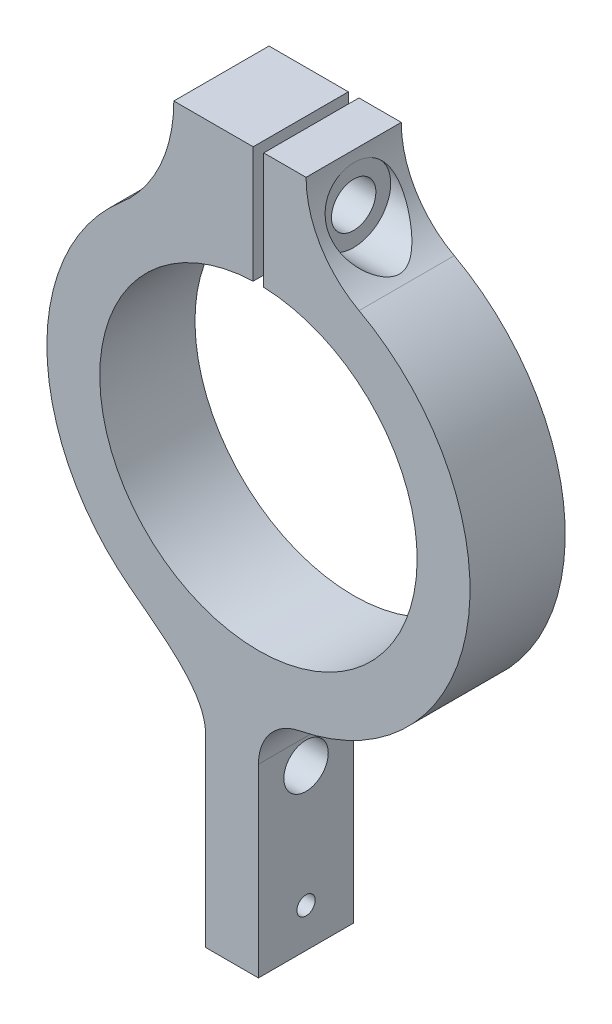
ISO-10303-21;
HEADER;
FILE_DESCRIPTION(('STEP AP214'),'2;1');
FILE_NAME('part.step','',(''),(''),'','','');
FILE_SCHEMA(('AUTOMOTIVE_DESIGN { 1 0 10303 214 1 1 1 1 }'));
ENDSEC;
DATA;
#1=APPLICATION_CONTEXT('core data for automotive mechanical design processes');
#2=APPLICATION_PROTOCOL_DEFINITION('international standard','automotive_design',2000,#1);
#3=PRODUCT_CONTEXT('',#1,'mechanical');
#4=PRODUCT('Part','Part','',(#3));
#5=PRODUCT_RELATED_PRODUCT_CATEGORY('part','',(#4));
#6=PRODUCT_DEFINITION_FORMATION('','',#4);
#7=PRODUCT_DEFINITION_CONTEXT('part definition',#1,'design');
#8=PRODUCT_DEFINITION('design','',#6,#7);
#9=PRODUCT_DEFINITION_SHAPE('','',#8);
#10=(LENGTH_UNIT() NAMED_UNIT(*) SI_UNIT(.MILLI.,.METRE.));
#11=(NAMED_UNIT(*) PLANE_ANGLE_UNIT() SI_UNIT($,.RADIAN.));
#12=(NAMED_UNIT(*) SI_UNIT($,.STERADIAN.) SOLID_ANGLE_UNIT());
#13=UNCERTAINTY_MEASURE_WITH_UNIT(LENGTH_MEASURE(1.E-05),#10,'distance_accuracy_value','');
#14=(GEOMETRIC_REPRESENTATION_CONTEXT(3) GLOBAL_UNCERTAINTY_ASSIGNED_CONTEXT((#13)) GLOBAL_UNIT_ASSIGNED_CONTEXT((#10,
#11,#12)) REPRESENTATION_CONTEXT('',''));
#15=CARTESIAN_POINT('',(0.,0.,0.));
#16=DIRECTION('',(0.,0.,1.));
#17=DIRECTION('',(1.,0.,0.));
#18=AXIS2_PLACEMENT_3D('',#15,#16,#17);
#19=CARTESIAN_POINT('',(28.1129032258065,52.,18.));
#20=DIRECTION('',(0.,0.,-1.));
#21=DIRECTION('',(-1.,0.,0.));
#22=AXIS2_PLACEMENT_3D('',#19,#20,#21);
#23=CYLINDRICAL_SURFACE('',#22,19.1129032258065);
#24=CARTESIAN_POINT('',(28.1129032258065,52.,0.));
#25=DIRECTION('',(0.,0.,-1.));
#26=DIRECTION('',(1.,0.,0.));
#27=AXIS2_PLACEMENT_3D('',#24,#25,#26);
#28=CIRCLE('',#27,19.1129032258065);
#29=CARTESIAN_POINT('',(19.0231923601637,35.1869031377899,0.));
#30=VERTEX_POINT('',#29);
#31=CARTESIAN_POINT('',(9.,52.,0.));
#32=VERTEX_POINT('',#31);
#33=EDGE_CURVE('E193',#30,#32,#28,.T.);
#34=ORIENTED_EDGE('',*,*,#33,.T.);
#35=DIRECTION('',(0.,0.,-1.));
#36=VECTOR('',#35,1.);
#37=CARTESIAN_POINT('',(9.,52.,18.));
#38=LINE('',#37,#36);
#39=CARTESIAN_POINT('',(9.,52.,18.));
#40=VERTEX_POINT('',#39);
#41=EDGE_CURVE('E219',#40,#32,#38,.T.);
#42=ORIENTED_EDGE('',*,*,#41,.F.);
#43=CARTESIAN_POINT('',(28.1129032258065,52.,18.));
#44=DIRECTION('',(0.,0.,-1.));
#45=DIRECTION('',(1.,0.,0.));
#46=AXIS2_PLACEMENT_3D('',#43,#44,#45);
#47=CIRCLE('',#46,19.1129032258065);
#48=CARTESIAN_POINT('',(19.0231923601637,35.1869031377899,18.));
#49=VERTEX_POINT('',#48);
#50=EDGE_CURVE('E327',#49,#40,#47,.T.);
#51=ORIENTED_EDGE('',*,*,#50,.F.);
#52=DIRECTION('',(0.,0.,-1.));
#53=VECTOR('',#52,1.);
#54=CARTESIAN_POINT('',(19.0231923601637,35.1869031377899,18.));
#55=LINE('',#54,#53);
#56=EDGE_CURVE('E222',#49,#30,#55,.T.);
#57=ORIENTED_EDGE('',*,*,#56,.T.);
#58=EDGE_LOOP('',(#34,#42,#51,#57));
#59=FACE_BOUND('',#58,.T.);
#60=CARTESIAN_POINT('',(17.6580923849044,36.,9.));
#61=CARTESIAN_POINT('',(17.6580901842161,36.0000010755365,8.88235732236984));
#62=CARTESIAN_POINT('',(17.6535371587383,36.002973632593,8.76467912745882));
#63=CARTESIAN_POINT('',(17.6354851467937,36.0147914781101,8.53026235110104));
#64=CARTESIAN_POINT('',(17.6219806304406,36.0236403967666,8.41352439564622));
#65=CARTESIAN_POINT('',(17.5864642358954,36.0470190077582,8.18167290114202));
#66=CARTESIAN_POINT('',(17.5644339522932,36.0615609910637,8.06656343880819));
#67=CARTESIAN_POINT('',(17.512568717232,36.0960085510067,7.83889149575266));
#68=CARTESIAN_POINT('',(17.4827293596723,36.1159171558351,7.72633049202438));
#69=CARTESIAN_POINT('',(17.4062616720574,36.1673250436832,7.47158695888006));
#70=CARTESIAN_POINT('',(17.3572771232616,36.2005110752184,7.3304506851968));
#71=CARTESIAN_POINT('',(17.2495002106957,36.2744217736509,7.05394997301961));
#72=CARTESIAN_POINT('',(17.1906998895253,36.3151525598523,6.91859033020005));
#73=CARTESIAN_POINT('',(17.0649892451219,36.4034436360839,6.65373386249375));
#74=CARTESIAN_POINT('',(16.9980653344239,36.4510153935157,6.52424737192376));
#75=CARTESIAN_POINT('',(16.8577664170625,36.5522668642214,6.2713959982453));
#76=CARTESIAN_POINT('',(16.7843930706783,36.6059450065683,6.14802955237135));
#77=CARTESIAN_POINT('',(16.5869619535518,36.752751243214,5.83500988027252));
#78=CARTESIAN_POINT('',(16.4588778191135,36.8502452943915,5.64993059203384));
#79=CARTESIAN_POINT('',(16.1936787939994,37.05799219418,5.2939175240548));
#80=CARTESIAN_POINT('',(16.0565584712705,37.1682527480078,5.12299239490636));
#81=CARTESIAN_POINT('',(15.7762000147324,37.4006159472294,4.79435722798566));
#82=CARTESIAN_POINT('',(15.6329549294902,37.5227322595644,4.63666284193071));
#83=CARTESIAN_POINT('',(15.3428275507618,37.7779895557299,4.33419288343536));
#84=CARTESIAN_POINT('',(15.195945952117,37.9111284446614,4.18941486698796));
#85=CARTESIAN_POINT('',(14.8915544317699,38.1961954860347,3.90426926188932));
#86=CARTESIAN_POINT('',(14.7339299173374,38.3487692858974,3.76466964529908));
#87=CARTESIAN_POINT('',(14.4183045731971,38.6654199953416,3.49963262572111));
#88=CARTESIAN_POINT('',(14.2603037147934,38.8294978111077,3.37419634043137));
#89=CARTESIAN_POINT('',(13.9455152442641,39.1687218688792,3.1379182261632));
#90=CARTESIAN_POINT('',(13.7887269728162,39.3438615397675,3.02706785111911));
#91=CARTESIAN_POINT('',(13.4776205933729,39.7049457043666,2.82052830141579));
#92=CARTESIAN_POINT('',(13.3233023759787,39.8908897178542,2.72483845361653));
#93=CARTESIAN_POINT('',(13.0196460542137,40.2715961632454,2.55024771855266));
#94=CARTESIAN_POINT('',(12.8702775970787,40.4662743018088,2.47121626422597));
#95=CARTESIAN_POINT('',(12.5764241674868,40.8652675781668,2.33009066481484));
#96=CARTESIAN_POINT('',(12.4319394005677,41.0695831207019,2.26799723181794));
#97=CARTESIAN_POINT('',(12.1491636081969,41.4868858519556,2.16210615525078));
#98=CARTESIAN_POINT('',(12.0108687137373,41.6998674603495,2.11829693634372));
#99=CARTESIAN_POINT('',(11.7415977901336,42.1334652014358,2.05037801304662));
#100=CARTESIAN_POINT('',(11.610620382729,42.3540798836641,2.02626458718918));
#101=CARTESIAN_POINT('',(11.3783240236921,42.7640475933536,2.00148797591833));
#102=CARTESIAN_POINT('',(11.2757042314319,42.9524707250311,1.99758187323488));
#103=CARTESIAN_POINT('',(11.0770039475465,43.3324088323346,2.00531686815198));
#104=CARTESIAN_POINT('',(10.9809222833666,43.5239232459043,2.01695517023872));
#105=CARTESIAN_POINT('',(10.7958985967472,43.9086487105881,2.05653278992353));
#106=CARTESIAN_POINT('',(10.7069542045307,44.1018591747295,2.08446667123787));
#107=CARTESIAN_POINT('',(10.5366556512286,44.4884620419484,2.15725451217697));
#108=CARTESIAN_POINT('',(10.4553015912212,44.6818544474141,2.20210869708437));
#109=CARTESIAN_POINT('',(10.3001239637233,45.068080318591,2.30945216492081));
#110=CARTESIAN_POINT('',(10.2263437525725,45.2609050259026,2.37203602054572));
#111=CARTESIAN_POINT('',(10.0870218333628,45.6429554686599,2.5149112360939));
#112=CARTESIAN_POINT('',(10.0214802357444,45.8321811558311,2.59520283335375));
#113=CARTESIAN_POINT('',(9.89865982124417,46.2049234372379,2.77335353838577));
#114=CARTESIAN_POINT('',(9.84137952945088,46.388441045951,2.87120950332814));
#115=CARTESIAN_POINT('',(9.7348848710466,46.7477039144138,3.08406405284738));
#116=CARTESIAN_POINT('',(9.6856698134005,46.923449839104,3.19906116714424));
#117=CARTESIAN_POINT('',(9.59921415895725,47.2489970685468,3.43381497979541));
#118=CARTESIAN_POINT('',(9.56128164189457,47.399681128527,3.55209656306455));
#119=CARTESIAN_POINT('',(9.49132078621771,47.6916050748106,3.80137746977728));
#120=CARTESIAN_POINT('',(9.4592922968812,47.8328452021469,3.93237646843104));
#121=CARTESIAN_POINT('',(9.40066346505474,48.1045571326457,4.20618170816906));
#122=CARTESIAN_POINT('',(9.37406241195237,48.2350303441831,4.34898640009303));
#123=CARTESIAN_POINT('',(9.32574401786717,48.4840630335401,4.64540217371016));
#124=CARTESIAN_POINT('',(9.30402670826509,48.6026224348043,4.79901332483245));
#125=CARTESIAN_POINT('',(9.26535060990003,48.8242785946145,5.11235565757578));
#126=CARTESIAN_POINT('',(9.24829585423533,48.9276629595022,5.27187173606287));
#127=CARTESIAN_POINT('',(9.21778146330255,49.1212754036867,5.59909717099794));
#128=CARTESIAN_POINT('',(9.20432303748869,49.2114990523826,5.76680926141082));
#129=CARTESIAN_POINT('',(9.18051298713507,49.3780262902558,6.10915190379966));
#130=CARTESIAN_POINT('',(9.17016039042411,49.4543342323196,6.28378027146164));
#131=CARTESIAN_POINT('',(9.15210240325127,49.5925195903312,6.63885768357837));
#132=CARTESIAN_POINT('',(9.14439794793474,49.6543919061149,6.81930875966575));
#133=CARTESIAN_POINT('',(9.13115744463525,49.7640445789032,7.18750071172405));
#134=CARTESIAN_POINT('',(9.12565596806724,49.8115975627345,7.3753105738621));
#135=CARTESIAN_POINT('',(9.11667431634353,49.8909826136002,7.75427194584981));
#136=CARTESIAN_POINT('',(9.11319416251163,49.9228145147859,7.94542349093037));
#137=CARTESIAN_POINT('',(9.10803796893861,49.9705311754312,8.32977346702599));
#138=CARTESIAN_POINT('',(9.10636232567179,49.9864124302762,8.52297233845279));
#139=CARTESIAN_POINT('',(9.10470704370399,50.0020986381108,8.90996673620945));
#140=CARTESIAN_POINT('',(9.10472686737902,50.0019086871987,9.10376205391791));
#141=CARTESIAN_POINT('',(9.10647087227074,49.985386069138,9.49255073887077));
#142=CARTESIAN_POINT('',(9.10821166960448,49.9688960236807,9.68753736364991));
#143=CARTESIAN_POINT('',(9.11353833364994,49.9196599054874,10.0754187340371));
#144=CARTESIAN_POINT('',(9.11712417260285,49.8869140773214,10.2683135110726));
#145=CARTESIAN_POINT('',(9.12636824118244,49.8054068250902,10.6506500559206));
#146=CARTESIAN_POINT('',(9.13202657863421,49.7566445677581,10.8400916435369));
#147=CARTESIAN_POINT('',(9.1457449499368,49.6434723505828,11.2141489234297));
#148=CARTESIAN_POINT('',(9.15380492796715,49.5790627544315,11.3987647277616));
#149=CARTESIAN_POINT('',(9.17273989372498,49.4351327177446,11.7617310068457));
#150=CARTESIAN_POINT('',(9.18361316668542,49.3556214898191,11.940085223232));
#151=CARTESIAN_POINT('',(9.20866286681949,49.1821211940099,12.2892813898708));
#152=CARTESIAN_POINT('',(9.22283802141064,49.0881377086154,12.4601262042532));
#153=CARTESIAN_POINT('',(9.25503649418175,48.8864234336076,12.793141021718));
#154=CARTESIAN_POINT('',(9.27306017819938,48.778691337456,12.9553101982683));
#155=CARTESIAN_POINT('',(9.31352246789939,48.5503934182944,13.2697635762989));
#156=CARTESIAN_POINT('',(9.33596101647602,48.4298277612943,13.4220479056047));
#157=CARTESIAN_POINT('',(9.38551933437672,48.1784332588251,13.7138594674856));
#158=CARTESIAN_POINT('',(9.41257969461673,48.0477449413501,13.8535178620048));
#159=CARTESIAN_POINT('',(9.47207704241666,47.7760201751177,14.1211319532272));
#160=CARTESIAN_POINT('',(9.50451397171938,47.6349838384944,14.2490877767091));
#161=CARTESIAN_POINT('',(9.57521358020898,47.3438687146599,14.4924301248725));
#162=CARTESIAN_POINT('',(9.61347514575994,47.193791659288,14.6078190450525));
#163=CARTESIAN_POINT('',(9.6961984575607,46.8859556017686,14.825364422272));
#164=CARTESIAN_POINT('',(9.74066015307694,46.7281966624861,14.9275209875743));
#165=CARTESIAN_POINT('',(9.83542831670913,46.4085416026135,15.116854161645));
#166=CARTESIAN_POINT('',(9.88565169970235,46.246725443378,15.204207521351));
#167=CARTESIAN_POINT('',(9.99253026980081,45.918475302548,15.365211707974));
#168=CARTESIAN_POINT('',(10.0491853671288,45.7520413854352,15.4388627261175));
#169=CARTESIAN_POINT('',(10.1689434082391,45.4159896604324,15.5723422568558));
#170=CARTESIAN_POINT('',(10.2320463515057,45.2463718527971,15.632170770556));
#171=CARTESIAN_POINT('',(10.3646030368729,44.9053269574933,15.7380721962035));
#172=CARTESIAN_POINT('',(10.4340573285119,44.7338997144042,15.7841439163965));
#173=CARTESIAN_POINT('',(10.581426250402,44.3850560548928,15.8640115153682));
#174=CARTESIAN_POINT('',(10.659540439746,44.2076234637414,15.8973675813909));
#175=CARTESIAN_POINT('',(10.8219770540319,43.8535351827961,15.9500735191975));
#176=CARTESIAN_POINT('',(10.906299577832,43.676879505421,15.9694231678975));
#177=CARTESIAN_POINT('',(11.0807650126027,43.3254490468986,15.9946499316714));
#178=CARTESIAN_POINT('',(11.1709093902944,43.1506747527758,16.0005236379812));
#179=CARTESIAN_POINT('',(11.3565383259361,42.8040239912164,15.9994030689073));
#180=CARTESIAN_POINT('',(11.4520234498026,42.6321478333933,15.9924074273466));
#181=CARTESIAN_POINT('',(11.659183607478,42.2724050343373,15.9646834753324));
#182=CARTESIAN_POINT('',(11.7714520260349,42.0849954491132,15.9424567211948));
#183=CARTESIAN_POINT('',(12.0012746733608,41.7157497756594,15.8837241844347));
#184=CARTESIAN_POINT('',(12.1188292614891,41.533914067765,15.8472174297402));
#185=CARTESIAN_POINT('',(12.3585051215781,41.1764922256395,15.7608159788059));
#186=CARTESIAN_POINT('',(12.4806275045959,41.0009076324505,15.710918006859));
#187=CARTESIAN_POINT('',(12.7286728508128,40.6565627779071,15.5985687137226));
#188=CARTESIAN_POINT('',(12.8545962976576,40.4878033914357,15.5361157892755));
#189=CARTESIAN_POINT('',(13.1331943396736,40.1268127749048,15.3866837054534));
#190=CARTESIAN_POINT('',(13.2864895024211,39.9360516351194,15.2973033718593));
#191=CARTESIAN_POINT('',(13.5960492798943,39.5652765363564,15.1029895466684));
#192=CARTESIAN_POINT('',(13.7523132503384,39.385260279898,14.99805939678));
#193=CARTESIAN_POINT('',(14.0667892547815,39.0360092975105,14.7732126378131));
#194=CARTESIAN_POINT('',(14.2250040444892,38.8667925885537,14.6532719249518));
#195=CARTESIAN_POINT('',(14.5416837649521,38.5398044273567,14.399032140431));
#196=CARTESIAN_POINT('',(14.7001486725623,38.3820319730498,14.2647343284425));
#197=CARTESIAN_POINT('',(15.0129224047312,38.0809537186052,13.9844300920289));
#198=CARTESIAN_POINT('',(15.1672552294794,37.9374417980192,13.8386720387986));
#199=CARTESIAN_POINT('',(15.472767520802,37.6622069494309,13.5332377896585));
#200=CARTESIAN_POINT('',(15.6239462287187,37.5304868331932,13.3735582919918));
#201=CARTESIAN_POINT('',(15.9204325488999,37.2797991033147,13.0401388344072));
#202=CARTESIAN_POINT('',(16.0657517882138,37.1608053731268,12.8664290056495));
#203=CARTESIAN_POINT('',(16.347606755101,36.9363585811639,12.5039505038252));
#204=CARTESIAN_POINT('',(16.4841485497689,36.8308961150603,12.315192438953));
#205=CARTESIAN_POINT('',(16.7574774804079,36.6250375380144,11.9014706224957));
#206=CARTESIAN_POINT('',(16.8928878828727,36.5262372932891,11.6747762441012));
#207=CARTESIAN_POINT('',(17.1398142662896,36.3501639382372,11.2007909564775));
#208=CARTESIAN_POINT('',(17.2513531235422,36.272870196535,10.9535200844148));
#209=CARTESIAN_POINT('',(17.4245860973591,36.1547403127534,10.4804477106735));
#210=CARTESIAN_POINT('',(17.4914063602804,36.1100443841642,10.2575673908491));
#211=CARTESIAN_POINT('',(17.5679665817325,36.0592256176079,9.91593353272351));
#212=CARTESIAN_POINT('',(17.5895324066883,36.0449960148583,9.80094857454984));
#213=CARTESIAN_POINT('',(17.6241604839674,36.0222095164915,9.56917490157863));
#214=CARTESIAN_POINT('',(17.6372281959941,36.013648978658,9.45238739432646));
#215=CARTESIAN_POINT('',(17.6498977845628,36.0053569809594,9.27944471985411));
#216=CARTESIAN_POINT('',(17.6529675234969,36.0033496991602,9.22362566105527));
#217=CARTESIAN_POINT('',(17.6570654690163,36.0006708730639,9.11187375370653));
#218=CARTESIAN_POINT('',(17.6580934313654,35.999999488566,9.05594089234459));
#219=CARTESIAN_POINT('',(17.6580923849044,36.,9.));
#220=B_SPLINE_CURVE_WITH_KNOTS('',3,(#60,#61,#62,#63,#64,#65,#66,#67,#68,#69,#70,#71,#72,#73,
#74,#75,#76,#77,#78,#79,#80,#81,#82,#83,#84,#85,#86,#87,#88,#89,#90,#91,#92,#93,#94,#95,#96,#97,
#98,#99,#100,#101,#102,#103,#104,#105,#106,#107,#108,#109,#110,#111,#112,#113,#114,#115,#116,
#117,#118,#119,#120,#121,#122,#123,#124,#125,#126,#127,#128,#129,#130,#131,#132,#133,#134,#135,
#136,#137,#138,#139,#140,#141,#142,#143,#144,#145,#146,#147,#148,#149,#150,#151,#152,#153,#154,
#155,#156,#157,#158,#159,#160,#161,#162,#163,#164,#165,#166,#167,#168,#169,#170,#171,#172,#173,
#174,#175,#176,#177,#178,#179,#180,#181,#182,#183,#184,#185,#186,#187,#188,#189,#190,#191,#192,
#193,#194,#195,#196,#197,#198,#199,#200,#201,#202,#203,#204,#205,#206,#207,#208,#209,#210,#211,
#212,#213,#214,#215,#216,#217,#218,#219),.UNSPECIFIED.,.T.,.F.,(4,2,2,2,2,2,2,2,2,2,2,2,2,2,2,2,
2,2,2,2,2,2,2,2,2,2,2,2,2,2,2,2,2,2,2,2,2,2,2,2,2,2,2,2,2,2,2,2,2,2,2,2,2,2,2,2,2,2,2,2,2,2,2,2,
2,2,2,2,2,2,2,2,2,2,2,2,2,2,2,4),(0.,0.352866236662386,0.70595066390632,1.05980161978727,
1.41385266046767,1.87224265053752,2.33100606672065,2.79054766371506,3.2499713053873,
3.98467826437169,4.71983098985473,5.45584147249893,6.19171239217291,6.97112910952103,
7.75060729154424,8.52962671446627,9.30861153857762,10.0812428795522,10.8539066975422,
11.6260806142187,12.3981085969271,13.0412466920351,13.6842691404266,14.3270771960056,
14.9698938104503,15.6162060411682,16.2625269349247,16.9087322961822,17.5548822611151,
18.1400105397797,18.7251238787937,19.3101605598833,19.8952010000489,20.4670943398871,
21.0391797674419,21.6110859363688,22.1831938570763,22.763957706771,23.3447276830754,
23.9256252360265,24.5063385899804,25.0927140748188,25.6790807378448,26.265477911877,
26.8518614575537,27.437888427718,28.0236899090869,28.609547101015,29.1953967154474,
29.7742157659106,30.353028545055,30.9317307972942,31.510428314487,32.0816367463399,
32.6528372059436,33.2240376198622,33.7952875026636,34.3848101918442,34.9743422703011,
35.5640234555274,36.1537672434052,36.811901219582,37.4700800042292,38.1284199369664,
38.7868439926656,39.5676922536484,40.348372950383,41.1303237387776,41.9122059761674,
42.680293820164,43.4485643301418,44.215226687568,44.9813532889208,45.8251007251881,
46.6680359344221,47.3757199912921,47.7288964067452,48.0818456954808,48.2496189197283,
48.4174122117105),.UNSPECIFIED.);
#221=CARTESIAN_POINT('',(17.6580923849044,36.,9.));
#222=VERTEX_POINT('',#221);
#223=EDGE_CURVE('E39',#222,#222,#220,.T.);
#224=ORIENTED_EDGE('',*,*,#223,.F.);
#225=EDGE_LOOP('',(#224));
#226=FACE_BOUND('',#225,.T.);
#227=ADVANCED_FACE('F34',(#59,#226),#23,.F.);
#228=CARTESIAN_POINT('',(1.,43.,9.));
#229=DIRECTION('',(-1.,0.,0.));
#230=DIRECTION('',(0.,0.,1.));
#231=AXIS2_PLACEMENT_3D('',#228,#229,#230);
#232=CYLINDRICAL_SURFACE('',#231,4.2);
#233=CARTESIAN_POINT('',(1.,43.,9.));
#234=DIRECTION('',(-1.,0.,0.));
#235=DIRECTION('',(0.,0.,1.));
#236=AXIS2_PLACEMENT_3D('',#233,#234,#235);
#237=CIRCLE('',#236,4.2);
#238=CARTESIAN_POINT('',(1.,43.,13.2));
#239=VERTEX_POINT('',#238);
#240=EDGE_CURVE('E180',#239,#239,#237,.T.);
#241=ORIENTED_EDGE('',*,*,#240,.T.);
#242=EDGE_LOOP('',(#241));
#243=FACE_BOUND('',#242,.T.);
#244=CARTESIAN_POINT('',(9.,43.,9.));
#245=DIRECTION('',(1.,0.,0.));
#246=DIRECTION('',(0.,1.,0.));
#247=AXIS2_PLACEMENT_3D('',#244,#245,#246);
#248=CIRCLE('',#247,4.2);
#249=CARTESIAN_POINT('',(9.,47.2,9.));
#250=VERTEX_POINT('',#249);
#251=EDGE_CURVE('E244',#250,#250,#248,.F.);
#252=ORIENTED_EDGE('',*,*,#251,.F.);
#253=EDGE_LOOP('',(#252));
#254=FACE_BOUND('',#253,.T.);
#255=ADVANCED_FACE('F256',(#243,#254),#232,.F.);
#256=CARTESIAN_POINT('',(-26.5352300309959,-29.9312807477751,18.));
#257=CARTESIAN_POINT('',(-20.9482126288613,-34.8843862697912,18.));
#258=CARTESIAN_POINT('',(-10.,-40.9040227720652,18.));
#259=CARTESIAN_POINT('',(-10.,-48.6004115208915,18.));
#260=B_SPLINE_CURVE_WITH_KNOTS('',3,(#256,#257,#258,#259),.UNSPECIFIED.,.F.,.F.,(4,4),(0.,1.),.UNSPECIFIED.);
#261=DIRECTION('',(0.,0.,-1.));
#262=VECTOR('',#261,1.);
#263=SURFACE_OF_LINEAR_EXTRUSION('',#260,#262);
#264=CARTESIAN_POINT('',(-26.5352300309959,-29.9312807477751,0.));
#265=CARTESIAN_POINT('',(-20.9482126288613,-34.8843862697912,0.));
#266=CARTESIAN_POINT('',(-10.,-40.9040227720652,0.));
#267=CARTESIAN_POINT('',(-10.,-48.6004115208915,0.));
#268=B_SPLINE_CURVE_WITH_KNOTS('',3,(#264,#265,#266,#267),.UNSPECIFIED.,.F.,.F.,(4,4),(0.,1.),.UNSPECIFIED.);
#269=CARTESIAN_POINT('',(-26.5352300309959,-29.9312807477751,0.));
#270=VERTEX_POINT('',#269);
#271=CARTESIAN_POINT('',(-10.,-48.6004115208915,0.));
#272=VERTEX_POINT('',#271);
#273=EDGE_CURVE('E174',#270,#272,#268,.T.);
#274=ORIENTED_EDGE('',*,*,#273,.T.);
#275=DIRECTION('',(0.,0.,-1.));
#276=VECTOR('',#275,1.);
#277=CARTESIAN_POINT('',(-10.,-48.6004115208915,18.));
#278=LINE('',#277,#276);
#279=CARTESIAN_POINT('',(-10.,-48.6004115208915,18.));
#280=VERTEX_POINT('',#279);
#281=EDGE_CURVE('E11',#280,#272,#278,.T.);
#282=ORIENTED_EDGE('',*,*,#281,.F.);
#283=CARTESIAN_POINT('',(-26.5352300309959,-29.9312807477751,18.));
#284=VERTEX_POINT('',#283);
#285=EDGE_CURVE('E206',#284,#280,#260,.T.);
#286=ORIENTED_EDGE('',*,*,#285,.F.);
#287=DIRECTION('',(0.,0.,-1.));
#288=VECTOR('',#287,1.);
#289=CARTESIAN_POINT('',(-26.5352300309959,-29.9312807477751,18.));
#290=LINE('',#289,#288);
#291=EDGE_CURVE('E170',#284,#270,#290,.T.);
#292=ORIENTED_EDGE('',*,*,#291,.T.);
#293=EDGE_LOOP('',(#274,#282,#286,#292));
#294=FACE_BOUND('',#293,.T.);
#295=ADVANCED_FACE('F36',(#294),#263,.F.);
#296=CARTESIAN_POINT('',(-9.99999999999999,-83.6004115208915,18.));
#297=DIRECTION('',(1.,0.,0.));
#298=DIRECTION('',(0.,1.,0.));
#299=AXIS2_PLACEMENT_3D('',#296,#297,#298);
#300=PLANE('',#299);
#301=CARTESIAN_POINT('',(-9.99999999999999,-76.2,9.));
#302=DIRECTION('',(1.,0.,0.));
#303=DIRECTION('',(0.,1.,0.));
#304=AXIS2_PLACEMENT_3D('',#301,#302,#303);
#305=CIRCLE('',#304,1.72719999999999);
#306=CARTESIAN_POINT('',(-9.99999999999999,-74.4728,9.));
#307=VERTEX_POINT('',#306);
#308=EDGE_CURVE('E305',#307,#307,#305,.T.);
#309=ORIENTED_EDGE('',*,*,#308,.T.);
#310=EDGE_LOOP('',(#309));
#311=FACE_BOUND('',#310,.T.);
#312=CARTESIAN_POINT('',(-10.,-53.34,9.));
#313=DIRECTION('',(1.,0.,0.));
#314=DIRECTION('',(0.,1.,0.));
#315=AXIS2_PLACEMENT_3D('',#312,#313,#314);
#316=CIRCLE('',#315,4.19999999999999);
#317=CARTESIAN_POINT('',(-10.,-49.14,9.));
#318=VERTEX_POINT('',#317);
#319=EDGE_CURVE('E243',#318,#318,#316,.T.);
#320=ORIENTED_EDGE('',*,*,#319,.T.);
#321=EDGE_LOOP('',(#320));
#322=FACE_BOUND('',#321,.T.);
#323=DIRECTION('',(0.,-1.,0.));
#324=VECTOR('',#323,1.);
#325=CARTESIAN_POINT('',(-9.99999999999999,-83.6004115208915,0.));
#326=LINE('',#325,#324);
#327=CARTESIAN_POINT('',(-9.99999999999999,-83.6004115208915,0.));
#328=VERTEX_POINT('',#327);
#329=EDGE_CURVE('E179',#272,#328,#326,.T.);
#330=ORIENTED_EDGE('',*,*,#329,.T.);
#331=DIRECTION('',(0.,0.,-1.));
#332=VECTOR('',#331,1.);
#333=CARTESIAN_POINT('',(-9.99999999999999,-83.6004115208915,18.));
#334=LINE('',#333,#332);
#335=CARTESIAN_POINT('',(-9.99999999999999,-83.6004115208915,18.));
#336=VERTEX_POINT('',#335);
#337=EDGE_CURVE('E49',#336,#328,#334,.T.);
#338=ORIENTED_EDGE('',*,*,#337,.F.);
#339=DIRECTION('',(0.,-1.,0.));
#340=VECTOR('',#339,1.);
#341=CARTESIAN_POINT('',(-9.99999999999999,-83.6004115208915,18.));
#342=LINE('',#341,#340);
#343=EDGE_CURVE('E119',#280,#336,#342,.T.);
#344=ORIENTED_EDGE('',*,*,#343,.F.);
#345=ORIENTED_EDGE('',*,*,#281,.T.);
#346=EDGE_LOOP('',(#330,#338,#344,#345));
#347=FACE_BOUND('',#346,.T.);
#348=ADVANCED_FACE('F294',(#311,#322,#347),#300,.F.);
#349=CARTESIAN_POINT('',(0.,-83.6004115208915,18.));
#350=DIRECTION('',(0.,1.,0.));
#351=DIRECTION('',(0.,0.,1.));
#352=AXIS2_PLACEMENT_3D('',#349,#350,#351);
#353=PLANE('',#352);
#354=DIRECTION('',(1.,0.,0.));
#355=VECTOR('',#354,1.);
#356=CARTESIAN_POINT('',(0.,-83.6004115208915,0.));
#357=LINE('',#356,#355);
#358=CARTESIAN_POINT('',(0.,-83.6004115208915,0.));
#359=VERTEX_POINT('',#358);
#360=EDGE_CURVE('E185',#328,#359,#357,.T.);
#361=ORIENTED_EDGE('',*,*,#360,.T.);
#362=DIRECTION('',(0.,0.,-1.));
#363=VECTOR('',#362,1.);
#364=CARTESIAN_POINT('',(0.,-83.6004115208915,18.));
#365=LINE('',#364,#363);
#366=CARTESIAN_POINT('',(0.,-83.6004115208915,18.));
#367=VERTEX_POINT('',#366);
#368=EDGE_CURVE('E231',#367,#359,#365,.T.);
#369=ORIENTED_EDGE('',*,*,#368,.F.);
#370=DIRECTION('',(1.,0.,0.));
#371=VECTOR('',#370,1.);
#372=CARTESIAN_POINT('',(0.,-83.6004115208915,18.));
#373=LINE('',#372,#371);
#374=EDGE_CURVE('E313',#336,#367,#373,.T.);
#375=ORIENTED_EDGE('',*,*,#374,.F.);
#376=ORIENTED_EDGE('',*,*,#337,.T.);
#377=EDGE_LOOP('',(#361,#369,#375,#376));
#378=FACE_BOUND('',#377,.T.);
#379=ADVANCED_FACE('F291',(#378),#353,.F.);
#380=CARTESIAN_POINT('',(0.,-48.6004115208915,18.));
#381=DIRECTION('',(-1.,0.,0.));
#382=DIRECTION('',(0.,-1.,0.));
#383=AXIS2_PLACEMENT_3D('',#380,#381,#382);
#384=PLANE('',#383);
#385=CARTESIAN_POINT('',(0.,-76.2,9.));
#386=DIRECTION('',(1.,0.,0.));
#387=DIRECTION('',(0.,0.,-1.));
#388=AXIS2_PLACEMENT_3D('',#385,#386,#387);
#389=CIRCLE('',#388,1.7272);
#390=CARTESIAN_POINT('',(0.,-76.2,7.2728));
#391=VERTEX_POINT('',#390);
#392=EDGE_CURVE('E369',#391,#391,#389,.T.);
#393=ORIENTED_EDGE('',*,*,#392,.F.);
#394=EDGE_LOOP('',(#393));
#395=FACE_BOUND('',#394,.T.);
#396=CARTESIAN_POINT('',(0.,-53.34,9.));
#397=DIRECTION('',(1.,0.,0.));
#398=DIRECTION('',(0.,0.,-1.));
#399=AXIS2_PLACEMENT_3D('',#396,#397,#398);
#400=CIRCLE('',#399,4.19999999999999);
#401=CARTESIAN_POINT('',(0.,-53.34,4.80000000000001));
#402=VERTEX_POINT('',#401);
#403=EDGE_CURVE('E362',#402,#402,#400,.T.);
#404=ORIENTED_EDGE('',*,*,#403,.F.);
#405=EDGE_LOOP('',(#404));
#406=FACE_BOUND('',#405,.T.);
#407=DIRECTION('',(0.,1.,0.));
#408=VECTOR('',#407,1.);
#409=CARTESIAN_POINT('',(0.,-48.6004115208915,0.));
#410=LINE('',#409,#408);
#411=CARTESIAN_POINT('',(0.,-48.6004115208915,0.));
#412=VERTEX_POINT('',#411);
#413=EDGE_CURVE('E187',#359,#412,#410,.T.);
#414=ORIENTED_EDGE('',*,*,#413,.T.);
#415=DIRECTION('',(0.,0.,-1.));
#416=VECTOR('',#415,1.);
#417=CARTESIAN_POINT('',(0.,-48.6004115208915,18.));
#418=LINE('',#417,#416);
#419=CARTESIAN_POINT('',(0.,-48.6004115208915,18.));
#420=VERTEX_POINT('',#419);
#421=EDGE_CURVE('E228',#420,#412,#418,.T.);
#422=ORIENTED_EDGE('',*,*,#421,.F.);
#423=DIRECTION('',(0.,1.,0.));
#424=VECTOR('',#423,1.);
#425=CARTESIAN_POINT('',(0.,-48.6004115208915,18.));
#426=LINE('',#425,#424);
#427=EDGE_CURVE('E325',#367,#420,#426,.T.);
#428=ORIENTED_EDGE('',*,*,#427,.F.);
#429=ORIENTED_EDGE('',*,*,#368,.T.);
#430=EDGE_LOOP('',(#414,#422,#428,#429));
#431=FACE_BOUND('',#430,.T.);
#432=ADVANCED_FACE('F287',(#395,#406,#431),#384,.F.);
#433=CARTESIAN_POINT('',(9.525,-48.6004115208915,18.));
#434=DIRECTION('',(0.,0.,-1.));
#435=DIRECTION('',(-1.,0.,0.));
#436=AXIS2_PLACEMENT_3D('',#433,#434,#435);
#437=CYLINDRICAL_SURFACE('',#436,9.525);
#438=CARTESIAN_POINT('',(9.525,-48.6004115208915,0.));
#439=DIRECTION('',(0.,0.,-1.));
#440=DIRECTION('',(-1.,0.,0.));
#441=AXIS2_PLACEMENT_3D('',#438,#439,#440);
#442=CIRCLE('',#441,9.525);
#443=CARTESIAN_POINT('',(7.69308430085814,-39.2532349487261,0.));
#444=VERTEX_POINT('',#443);
#445=EDGE_CURVE('E189',#412,#444,#442,.T.);
#446=ORIENTED_EDGE('',*,*,#445,.T.);
#447=DIRECTION('',(0.,0.,-1.));
#448=VECTOR('',#447,1.);
#449=CARTESIAN_POINT('',(7.69308430085814,-39.2532349487261,18.));
#450=LINE('',#449,#448);
#451=CARTESIAN_POINT('',(7.69308430085814,-39.2532349487261,18.));
#452=VERTEX_POINT('',#451);
#453=EDGE_CURVE('E225',#452,#444,#450,.T.);
#454=ORIENTED_EDGE('',*,*,#453,.F.);
#455=CARTESIAN_POINT('',(9.525,-48.6004115208915,18.));
#456=DIRECTION('',(0.,0.,-1.));
#457=DIRECTION('',(-1.,0.,0.));
#458=AXIS2_PLACEMENT_3D('',#455,#456,#457);
#459=CIRCLE('',#458,9.525);
#460=EDGE_CURVE('E322',#420,#452,#459,.T.);
#461=ORIENTED_EDGE('',*,*,#460,.F.);
#462=ORIENTED_EDGE('',*,*,#421,.T.);
#463=EDGE_LOOP('',(#446,#454,#461,#462));
#464=FACE_BOUND('',#463,.T.);
#465=ADVANCED_FACE('F283',(#464),#437,.F.);
#466=CARTESIAN_POINT('',(0.,0.,18.));
#467=DIRECTION('',(0.,0.,-1.));
#468=DIRECTION('',(-1.,0.,0.));
#469=AXIS2_PLACEMENT_3D('',#466,#467,#468);
#470=CYLINDRICAL_SURFACE('',#469,40.);
#471=CARTESIAN_POINT('',(0.,0.,0.));
#472=DIRECTION('',(0.,0.,1.));
#473=DIRECTION('',(1.,0.,0.));
#474=AXIS2_PLACEMENT_3D('',#471,#472,#473);
#475=CIRCLE('',#474,40.);
#476=EDGE_CURVE('E191',#444,#30,#475,.T.);
#477=ORIENTED_EDGE('',*,*,#476,.T.);
#478=ORIENTED_EDGE('',*,*,#56,.F.);
#479=CARTESIAN_POINT('',(0.,0.,18.));
#480=DIRECTION('',(0.,0.,1.));
#481=DIRECTION('',(1.,0.,0.));
#482=AXIS2_PLACEMENT_3D('',#479,#480,#481);
#483=CIRCLE('',#482,40.);
#484=EDGE_CURVE('E324',#452,#49,#483,.T.);
#485=ORIENTED_EDGE('',*,*,#484,.F.);
#486=ORIENTED_EDGE('',*,*,#453,.T.);
#487=EDGE_LOOP('',(#477,#478,#485,#486));
#488=FACE_BOUND('',#487,.T.);
#489=ADVANCED_FACE('F280',(#488),#470,.T.);
#490=CARTESIAN_POINT('',(1.,52.,18.));
#491=DIRECTION('',(0.,-1.,0.));
#492=DIRECTION('',(0.,0.,-1.));
#493=AXIS2_PLACEMENT_3D('',#490,#491,#492);
#494=PLANE('',#493);
#495=DIRECTION('',(-1.,0.,0.));
#496=VECTOR('',#495,1.);
#497=CARTESIAN_POINT('',(1.,52.,0.));
#498=LINE('',#497,#496);
#499=CARTESIAN_POINT('',(1.,52.,0.));
#500=VERTEX_POINT('',#499);
#501=EDGE_CURVE('E195',#32,#500,#498,.T.);
#502=ORIENTED_EDGE('',*,*,#501,.T.);
#503=DIRECTION('',(0.,0.,-1.));
#504=VECTOR('',#503,1.);
#505=CARTESIAN_POINT('',(1.,52.,18.));
#506=LINE('',#505,#504);
#507=CARTESIAN_POINT('',(1.,52.,18.));
#508=VERTEX_POINT('',#507);
#509=EDGE_CURVE('E216',#508,#500,#506,.T.);
#510=ORIENTED_EDGE('',*,*,#509,.F.);
#511=DIRECTION('',(-1.,0.,0.));
#512=VECTOR('',#511,1.);
#513=CARTESIAN_POINT('',(1.,52.,18.));
#514=LINE('',#513,#512);
#515=EDGE_CURVE('E333',#40,#508,#514,.T.);
#516=ORIENTED_EDGE('',*,*,#515,.F.);
#517=ORIENTED_EDGE('',*,*,#41,.T.);
#518=EDGE_LOOP('',(#502,#510,#516,#517));
#519=FACE_BOUND('',#518,.T.);
#520=ADVANCED_FACE('F278',(#519),#494,.F.);
#521=CARTESIAN_POINT('',(1.,52.,18.));
#522=DIRECTION('',(1.,0.,0.));
#523=DIRECTION('',(0.,1.,0.));
#524=AXIS2_PLACEMENT_3D('',#521,#522,#523);
#525=PLANE('',#524);
#526=ORIENTED_EDGE('',*,*,#240,.F.);
#527=EDGE_LOOP('',(#526));
#528=FACE_BOUND('',#527,.T.);
#529=DIRECTION('',(0.,-1.,0.));
#530=VECTOR('',#529,1.);
#531=CARTESIAN_POINT('',(1.,52.,0.));
#532=LINE('',#531,#530);
#533=CARTESIAN_POINT('',(1.00000000000001,29.9833287011299,0.));
#534=VERTEX_POINT('',#533);
#535=EDGE_CURVE('E197',#500,#534,#532,.T.);
#536=ORIENTED_EDGE('',*,*,#535,.T.);
#537=DIRECTION('',(0.,0.,-1.));
#538=VECTOR('',#537,1.);
#539=CARTESIAN_POINT('',(1.00000000000001,29.9833287011299,18.));
#540=LINE('',#539,#538);
#541=CARTESIAN_POINT('',(1.00000000000001,29.9833287011299,18.));
#542=VERTEX_POINT('',#541);
#543=EDGE_CURVE('E213',#542,#534,#540,.T.);
#544=ORIENTED_EDGE('',*,*,#543,.F.);
#545=DIRECTION('',(0.,-1.,0.));
#546=VECTOR('',#545,1.);
#547=CARTESIAN_POINT('',(1.,52.,18.));
#548=LINE('',#547,#546);
#549=EDGE_CURVE('E335',#508,#542,#548,.T.);
#550=ORIENTED_EDGE('',*,*,#549,.F.);
#551=ORIENTED_EDGE('',*,*,#509,.T.);
#552=EDGE_LOOP('',(#536,#544,#550,#551));
#553=FACE_BOUND('',#552,.T.);
#554=ADVANCED_FACE('F439',(#528,#553),#525,.F.);
#555=CARTESIAN_POINT('',(0.,0.,18.));
#556=DIRECTION('',(0.,0.,-1.));
#557=DIRECTION('',(-1.,0.,0.));
#558=AXIS2_PLACEMENT_3D('',#555,#556,#557);
#559=CYLINDRICAL_SURFACE('',#558,30.);
#560=CARTESIAN_POINT('',(0.,0.,0.));
#561=DIRECTION('',(0.,0.,-1.));
#562=DIRECTION('',(1.,0.,0.));
#563=AXIS2_PLACEMENT_3D('',#560,#561,#562);
#564=CIRCLE('',#563,30.);
#565=CARTESIAN_POINT('',(-0.999999999999998,29.9833287011299,0.));
#566=VERTEX_POINT('',#565);
#567=EDGE_CURVE('E199',#534,#566,#564,.T.);
#568=ORIENTED_EDGE('',*,*,#567,.T.);
#569=DIRECTION('',(0.,0.,-1.));
#570=VECTOR('',#569,1.);
#571=CARTESIAN_POINT('',(-0.999999999999998,29.9833287011299,18.));
#572=LINE('',#571,#570);
#573=CARTESIAN_POINT('',(-0.999999999999998,29.9833287011299,18.));
#574=VERTEX_POINT('',#573);
#575=EDGE_CURVE('E210',#574,#566,#572,.T.);
#576=ORIENTED_EDGE('',*,*,#575,.F.);
#577=CARTESIAN_POINT('',(0.,0.,18.));
#578=DIRECTION('',(0.,0.,-1.));
#579=DIRECTION('',(1.,0.,0.));
#580=AXIS2_PLACEMENT_3D('',#577,#578,#579);
#581=CIRCLE('',#580,30.);
#582=EDGE_CURVE('E337',#542,#574,#581,.T.);
#583=ORIENTED_EDGE('',*,*,#582,.F.);
#584=ORIENTED_EDGE('',*,*,#543,.T.);
#585=EDGE_LOOP('',(#568,#576,#583,#584));
#586=FACE_BOUND('',#585,.T.);
#587=ADVANCED_FACE('F343',(#586),#559,.F.);
#588=CARTESIAN_POINT('',(-1.,52.,18.));
#589=DIRECTION('',(-1.,0.,0.));
#590=DIRECTION('',(0.,-1.,0.));
#591=AXIS2_PLACEMENT_3D('',#588,#589,#590);
#592=PLANE('',#591);
#593=CARTESIAN_POINT('',(-0.999999999999999,43.,9.));
#594=DIRECTION('',(-1.,0.,0.));
#595=DIRECTION('',(0.,-1.,0.));
#596=AXIS2_PLACEMENT_3D('',#593,#594,#595);
#597=CIRCLE('',#596,4.19999999999999);
#598=CARTESIAN_POINT('',(-0.999999999999999,38.8,9.));
#599=VERTEX_POINT('',#598);
#600=EDGE_CURVE('E242',#599,#599,#597,.T.);
#601=ORIENTED_EDGE('',*,*,#600,.T.);
#602=EDGE_LOOP('',(#601));
#603=FACE_BOUND('',#602,.T.);
#604=DIRECTION('',(0.,1.,0.));
#605=VECTOR('',#604,1.);
#606=CARTESIAN_POINT('',(-1.,52.,0.));
#607=LINE('',#606,#605);
#608=CARTESIAN_POINT('',(-1.,52.,0.));
#609=VERTEX_POINT('',#608);
#610=EDGE_CURVE('E201',#566,#609,#607,.T.);
#611=ORIENTED_EDGE('',*,*,#610,.T.);
#612=DIRECTION('',(0.,0.,-1.));
#613=VECTOR('',#612,1.);
#614=CARTESIAN_POINT('',(-1.,52.,18.));
#615=LINE('',#614,#613);
#616=CARTESIAN_POINT('',(-1.,52.,18.));
#617=VERTEX_POINT('',#616);
#618=EDGE_CURVE('E165',#617,#609,#615,.T.);
#619=ORIENTED_EDGE('',*,*,#618,.F.);
#620=DIRECTION('',(0.,1.,0.));
#621=VECTOR('',#620,1.);
#622=CARTESIAN_POINT('',(-1.,52.,18.));
#623=LINE('',#622,#621);
#624=EDGE_CURVE('E156',#574,#617,#623,.T.);
#625=ORIENTED_EDGE('',*,*,#624,.F.);
#626=ORIENTED_EDGE('',*,*,#575,.T.);
#627=EDGE_LOOP('',(#611,#619,#625,#626));
#628=FACE_BOUND('',#627,.T.);
#629=ADVANCED_FACE('F347',(#603,#628),#592,.F.);
#630=CARTESIAN_POINT('',(-1.,52.,18.));
#631=DIRECTION('',(0.,-1.,0.));
#632=DIRECTION('',(0.,0.,-1.));
#633=AXIS2_PLACEMENT_3D('',#630,#631,#632);
#634=PLANE('',#633);
#635=DIRECTION('',(-1.,0.,0.));
#636=VECTOR('',#635,1.);
#637=CARTESIAN_POINT('',(-1.,52.,0.));
#638=LINE('',#637,#636);
#639=CARTESIAN_POINT('',(-16.,52.,0.));
#640=VERTEX_POINT('',#639);
#641=EDGE_CURVE('E164',#609,#640,#638,.T.);
#642=ORIENTED_EDGE('',*,*,#641,.T.);
#643=DIRECTION('',(0.,0.,-1.));
#644=VECTOR('',#643,1.);
#645=CARTESIAN_POINT('',(-16.,52.,18.));
#646=LINE('',#645,#644);
#647=CARTESIAN_POINT('',(-16.,52.,18.));
#648=VERTEX_POINT('',#647);
#649=EDGE_CURVE('E161',#648,#640,#646,.T.);
#650=ORIENTED_EDGE('',*,*,#649,.F.);
#651=DIRECTION('',(-1.,0.,0.));
#652=VECTOR('',#651,1.);
#653=CARTESIAN_POINT('',(-1.,52.,18.));
#654=LINE('',#653,#652);
#655=EDGE_CURVE('E150',#617,#648,#654,.T.);
#656=ORIENTED_EDGE('',*,*,#655,.F.);
#657=ORIENTED_EDGE('',*,*,#618,.T.);
#658=EDGE_LOOP('',(#642,#650,#656,#657));
#659=FACE_BOUND('',#658,.T.);
#660=ADVANCED_FACE('F162',(#659),#634,.F.);
#661=CARTESIAN_POINT('',(-44.3333333333333,52.,18.));
#662=DIRECTION('',(0.,0.,-1.));
#663=DIRECTION('',(-1.,0.,0.));
#664=AXIS2_PLACEMENT_3D('',#661,#662,#663);
#665=CYLINDRICAL_SURFACE('',#664,28.3333333333333);
#666=CARTESIAN_POINT('',(-17.4674110938535,43.,4.80000000000001));
#667=CARTESIAN_POINT('',(-17.388218437458,43.2364077454225,4.80000694891413));
#668=CARTESIAN_POINT('',(-17.3121361857054,43.4739693805621,4.82000519046075));
#669=CARTESIAN_POINT('',(-17.1680712284813,43.944753682469,4.90066966218323));
#670=CARTESIAN_POINT('',(-17.1000923715462,44.1779742435152,4.96135512597869));
#671=CARTESIAN_POINT('',(-16.9734258295955,44.633238710482,5.12302223193914));
#672=CARTESIAN_POINT('',(-16.9147543514321,44.8552626712451,5.2240731089089));
#673=CARTESIAN_POINT('',(-16.8075214345483,45.2802134683643,5.46444023563026));
#674=CARTESIAN_POINT('',(-16.7589576022309,45.4831448197998,5.60374740772234));
#675=CARTESIAN_POINT('',(-16.673500464268,45.8561541502749,5.91150440664498));
#676=CARTESIAN_POINT('',(-16.6362592940731,46.0271308949226,6.07876881733093));
#677=CARTESIAN_POINT('',(-16.5708564963273,46.338896103705,6.44093007254733));
#678=CARTESIAN_POINT('',(-16.5426937914009,46.4796881493069,6.63582363426735));
#679=CARTESIAN_POINT('',(-16.4954420315791,46.723197701026,7.04231667334589));
#680=CARTESIAN_POINT('',(-16.4761418434516,46.8267867407675,7.25337014218427));
#681=CARTESIAN_POINT('',(-16.4449874479141,46.997449213008,7.69027062816263));
#682=CARTESIAN_POINT('',(-16.4331328221083,47.0645246973202,7.91611681325347));
#683=CARTESIAN_POINT('',(-16.416473191519,47.1596453664576,8.37419598512123));
#684=CARTESIAN_POINT('',(-16.4116113035605,47.1880053890292,8.6063616005137));
#685=CARTESIAN_POINT('',(-16.4085428000486,47.2058431580863,9.07222500807256));
#686=CARTESIAN_POINT('',(-16.4103360882294,47.1953214669878,9.30592277802783));
#687=CARTESIAN_POINT('',(-16.4206498895341,47.1357658136136,9.76784853936621));
#688=CARTESIAN_POINT('',(-16.4291603344769,47.086789490613,9.99608419068824));
#689=CARTESIAN_POINT('',(-16.4532462283329,46.9519136130095,10.4409739563159));
#690=CARTESIAN_POINT('',(-16.4688215766671,46.8660145840543,10.6576282354496));
#691=CARTESIAN_POINT('',(-16.5075869932562,46.6599096017653,11.0733857245588));
#692=CARTESIAN_POINT('',(-16.5307820353181,46.5396812464527,11.2724773624304));
#693=CARTESIAN_POINT('',(-16.5853699052757,46.2687404529722,11.6474203969525));
#694=CARTESIAN_POINT('',(-16.6167626363408,46.118028374881,11.8232720680752));
#695=CARTESIAN_POINT('',(-16.6883942598439,45.7900591610501,12.1478671024236));
#696=CARTESIAN_POINT('',(-16.728676819542,45.61267241854,12.2964697790078));
#697=CARTESIAN_POINT('',(-16.8181799525602,45.2375112962022,12.5617893248249));
#698=CARTESIAN_POINT('',(-16.8674009707143,45.0397359019186,12.6785046064158));
#699=CARTESIAN_POINT('',(-16.9755021616968,44.6261762278739,12.8793459173472));
#700=CARTESIAN_POINT('',(-17.0345379471776,44.4101350600403,12.9628582447209));
#701=CARTESIAN_POINT('',(-17.1608782197461,43.9695582811347,13.0930128822841));
#702=CARTESIAN_POINT('',(-17.2281841044045,43.7450212387875,13.1396489507976));
#703=CARTESIAN_POINT('',(-17.3725270682996,43.2848978305965,13.1969776177008));
#704=CARTESIAN_POINT('',(-17.4498383317665,43.0492179294785,13.2062233579327));
#705=CARTESIAN_POINT('',(-17.6101003005487,42.5815191402499,13.1856563430846));
#706=CARTESIAN_POINT('',(-17.6930525173828,42.3495012540756,13.1558330798803));
#707=CARTESIAN_POINT('',(-17.8665974197078,41.8829486238193,13.056103875445));
#708=CARTESIAN_POINT('',(-17.9573634644568,41.6489023214673,12.9842081245988));
#709=CARTESIAN_POINT('',(-18.1392568508187,41.196870257139,12.8010888784653));
#710=CARTESIAN_POINT('',(-18.230384298519,40.978889646035,12.6898528358732));
#711=CARTESIAN_POINT('',(-18.4121178320089,40.5578634739251,12.4262893266234));
#712=CARTESIAN_POINT('',(-18.5026179047783,40.3555008501934,12.272782388078));
#713=CARTESIAN_POINT('',(-18.6320330109374,40.0739053622172,12.0156590595675));
#714=CARTESIAN_POINT('',(-18.6741394638945,39.9836495826877,11.92541041181));
#715=CARTESIAN_POINT('',(-18.7556084867832,39.811200724805,11.7364017821605));
#716=CARTESIAN_POINT('',(-18.7949724245506,39.7290036187181,11.6376460989409));
#717=CARTESIAN_POINT('',(-18.8689731492995,39.5761880116072,11.435770959888));
#718=CARTESIAN_POINT('',(-18.903727038955,39.505265325259,11.3329244880473));
#719=CARTESIAN_POINT('',(-18.9694259734013,39.3724321973833,11.1204795392005));
#720=CARTESIAN_POINT('',(-19.000372929698,39.3105172300982,11.0108844925579));
#721=CARTESIAN_POINT('',(-19.0578462488854,39.1964218677884,10.7856979606512));
#722=CARTESIAN_POINT('',(-19.0843748379801,39.144236568856,10.6701095338986));
#723=CARTESIAN_POINT('',(-19.1324433759101,39.0502620369736,10.4337828590816));
#724=CARTESIAN_POINT('',(-19.1539839666368,39.0084714663044,10.3130452760181));
#725=CARTESIAN_POINT('',(-19.1896150095806,38.9396574417736,10.0801840361543));
#726=CARTESIAN_POINT('',(-19.2042456394987,38.9115535965615,9.9684613149336));
#727=CARTESIAN_POINT('',(-19.2287780165052,38.8645599447819,9.74258851368365));
#728=CARTESIAN_POINT('',(-19.2386802901467,38.8456691122418,9.62843870541604));
#729=CARTESIAN_POINT('',(-19.2535363219841,38.8173668858998,9.39870842836766));
#730=CARTESIAN_POINT('',(-19.258492567883,38.8079507266028,9.28312870843591));
#731=CARTESIAN_POINT('',(-19.2633528795658,38.7987164787774,9.05148240765896));
#732=CARTESIAN_POINT('',(-19.263257227406,38.7988978544022,8.9354158543563));
#733=CARTESIAN_POINT('',(-19.2582468472559,38.8084179179058,8.71393706937361));
#734=CARTESIAN_POINT('',(-19.253753771272,38.8169553764457,8.60847972516933));
#735=CARTESIAN_POINT('',(-19.2406471716041,38.8419196806961,8.3987289124704));
#736=CARTESIAN_POINT('',(-19.2320323457177,38.8583490197292,8.29443582246719));
#737=CARTESIAN_POINT('',(-19.2108411281712,38.8989051520199,8.08780609413584));
#738=CARTESIAN_POINT('',(-19.1982662377759,38.923029028314,7.98546872995849));
#739=CARTESIAN_POINT('',(-19.1693774917324,38.9787066103223,7.78336244009502));
#740=CARTESIAN_POINT('',(-19.1530622088945,39.0102631521816,7.68359451101101));
#741=CARTESIAN_POINT('',(-19.0986361060806,39.1161263149418,7.38769742856522));
#742=CARTESIAN_POINT('',(-19.0551871559983,39.2013592213305,7.19631912757815));
#743=CARTESIAN_POINT('',(-18.9567792110368,39.3976083456795,6.83068213263975));
#744=CARTESIAN_POINT('',(-18.9018170308322,39.5086316999214,6.65642819606893));
#745=CARTESIAN_POINT('',(-18.7779467536112,39.7639143590778,6.31349448192559));
#746=CARTESIAN_POINT('',(-18.7082395369663,39.9102306903231,6.14663371265651));
#747=CARTESIAN_POINT('',(-18.561898079825,40.2254043958022,5.83928080125478));
#748=CARTESIAN_POINT('',(-18.4852595257084,40.3942758384924,5.69880524922312));
#749=CARTESIAN_POINT('',(-18.3202674146754,40.7686124493298,5.43367457507053));
#750=CARTESIAN_POINT('',(-18.2315123972332,40.97605090299,5.3120498950929));
#751=CARTESIAN_POINT('',(-18.053192019532,41.408187670327,5.10598008790239));
#752=CARTESIAN_POINT('',(-17.9636270815553,41.6328774009127,5.02151661073197));
#753=CARTESIAN_POINT('',(-17.8048442854195,42.0473169004879,4.90501752050341));
#754=CARTESIAN_POINT('',(-17.7351824679198,42.2349156543238,4.86582468417835));
#755=CARTESIAN_POINT('',(-17.5987931481038,42.614753371809,4.81331366268693));
#756=CARTESIAN_POINT('',(-17.5320655154157,42.8069921287047,4.79999432677166));
#757=CARTESIAN_POINT('',(-17.4674110938535,43.,4.80000000000001));
#758=B_SPLINE_CURVE_WITH_KNOTS('',3,(#666,#667,#668,#669,#670,#671,#672,#673,#674,#675,#676,
#677,#678,#679,#680,#681,#682,#683,#684,#685,#686,#687,#688,#689,#690,#691,#692,#693,#694,#695,
#696,#697,#698,#699,#700,#701,#702,#703,#704,#705,#706,#707,#708,#709,#710,#711,#712,#713,#714,
#715,#716,#717,#718,#719,#720,#721,#722,#723,#724,#725,#726,#727,#728,#729,#730,#731,#732,#733,
#734,#735,#736,#737,#738,#739,#740,#741,#742,#743,#744,#745,#746,#747,#748,#749,#750,#751,#752,
#753,#754,#755,#756,#757),.UNSPECIFIED.,.T.,.F.,(4,2,2,2,2,2,2,2,2,2,2,2,2,2,2,2,2,2,2,2,2,2,2,
2,2,2,2,2,2,2,2,2,2,2,2,2,2,2,2,2,2,2,2,2,2,4),(0.,0.747271820418267,1.49489713965922,
2.24381033101218,2.99254596953306,3.71517655241203,4.4377213464058,5.14202386238217,
5.84628679726379,6.5447877830519,7.24327866520455,7.94072458017611,8.63816056633198,
9.33605271622228,10.033936623023,10.7353280497178,11.4367543916407,12.1506018337319,
12.8645700758016,13.6059160617829,14.347461483502,15.1272896796493,15.907366821063,
16.7119126667118,17.1146807906556,17.5172465733111,17.9057484056495,18.2940543634642,
18.6821640766735,19.0702238173575,19.4181405702097,19.7660185697633,20.1137215088357,
20.4614050350787,20.778720137726,21.0961355573728,21.4134307890399,21.730847290441,
22.3697647375349,23.0088591857211,23.7038236617793,24.3992236550081,25.1648525587958,
25.9301029745857,26.5402173270216,27.1503045434116),.UNSPECIFIED.);
#759=CARTESIAN_POINT('',(-17.4674110938535,43.,4.80000000000001));
#760=VERTEX_POINT('',#759);
#761=EDGE_CURVE('E236',#760,#760,#758,.T.);
#762=ORIENTED_EDGE('',*,*,#761,.T.);
#763=EDGE_LOOP('',(#762));
#764=FACE_BOUND('',#763,.T.);
#765=CARTESIAN_POINT('',(-44.3333333333333,52.,0.));
#766=DIRECTION('',(0.,0.,-1.));
#767=DIRECTION('',(1.,0.,0.));
#768=AXIS2_PLACEMENT_3D('',#765,#766,#767);
#769=CIRCLE('',#768,28.3333333333333);
#770=CARTESIAN_POINT('',(-25.9512195121951,30.4390243902439,0.));
#771=VERTEX_POINT('',#770);
#772=EDGE_CURVE('E105',#640,#771,#769,.T.);
#773=ORIENTED_EDGE('',*,*,#772,.T.);
#774=DIRECTION('',(0.,0.,-1.));
#775=VECTOR('',#774,1.);
#776=CARTESIAN_POINT('',(-25.9512195121951,30.4390243902439,18.));
#777=LINE('',#776,#775);
#778=CARTESIAN_POINT('',(-25.9512195121951,30.4390243902439,18.));
#779=VERTEX_POINT('',#778);
#780=EDGE_CURVE('E166',#779,#771,#777,.T.);
#781=ORIENTED_EDGE('',*,*,#780,.F.);
#782=CARTESIAN_POINT('',(-44.3333333333333,52.,18.));
#783=DIRECTION('',(0.,0.,-1.));
#784=DIRECTION('',(1.,0.,0.));
#785=AXIS2_PLACEMENT_3D('',#782,#783,#784);
#786=CIRCLE('',#785,28.3333333333333);
#787=EDGE_CURVE('E154',#648,#779,#786,.T.);
#788=ORIENTED_EDGE('',*,*,#787,.F.);
#789=ORIENTED_EDGE('',*,*,#649,.T.);
#790=EDGE_LOOP('',(#773,#781,#788,#789));
#791=FACE_BOUND('',#790,.T.);
#792=ADVANCED_FACE('F168',(#764,#791),#665,.F.);
#793=CARTESIAN_POINT('',(0.,0.,18.));
#794=DIRECTION('',(0.,0.,-1.));
#795=DIRECTION('',(-1.,0.,0.));
#796=AXIS2_PLACEMENT_3D('',#793,#794,#795);
#797=CYLINDRICAL_SURFACE('',#796,40.);
#798=CARTESIAN_POINT('',(0.,0.,0.));
#799=DIRECTION('',(0.,0.,1.));
#800=DIRECTION('',(1.,0.,0.));
#801=AXIS2_PLACEMENT_3D('',#798,#799,#800);
#802=CIRCLE('',#801,40.);
#803=EDGE_CURVE('E111',#771,#270,#802,.T.);
#804=ORIENTED_EDGE('',*,*,#803,.T.);
#805=ORIENTED_EDGE('',*,*,#291,.F.);
#806=CARTESIAN_POINT('',(0.,0.,18.));
#807=DIRECTION('',(0.,0.,1.));
#808=DIRECTION('',(1.,0.,0.));
#809=AXIS2_PLACEMENT_3D('',#806,#807,#808);
#810=CIRCLE('',#809,40.);
#811=EDGE_CURVE('E58',#779,#284,#810,.T.);
#812=ORIENTED_EDGE('',*,*,#811,.F.);
#813=ORIENTED_EDGE('',*,*,#780,.T.);
#814=EDGE_LOOP('',(#804,#805,#812,#813));
#815=FACE_BOUND('',#814,.T.);
#816=ADVANCED_FACE('F262',(#815),#797,.T.);
#817=CARTESIAN_POINT('',(-16.1724834896975,-38.2371149242795,18.));
#818=DIRECTION('',(0.,0.,-1.));
#819=DIRECTION('',(-1.,0.,0.));
#820=AXIS2_PLACEMENT_3D('',#817,#818,#819);
#821=PLANE('',#820);
#822=ORIENTED_EDGE('',*,*,#285,.T.);
#823=ORIENTED_EDGE('',*,*,#343,.T.);
#824=ORIENTED_EDGE('',*,*,#374,.T.);
#825=ORIENTED_EDGE('',*,*,#427,.T.);
#826=ORIENTED_EDGE('',*,*,#460,.T.);
#827=ORIENTED_EDGE('',*,*,#484,.T.);
#828=ORIENTED_EDGE('',*,*,#50,.T.);
#829=ORIENTED_EDGE('',*,*,#515,.T.);
#830=ORIENTED_EDGE('',*,*,#549,.T.);
#831=ORIENTED_EDGE('',*,*,#582,.T.);
#832=ORIENTED_EDGE('',*,*,#624,.T.);
#833=ORIENTED_EDGE('',*,*,#655,.T.);
#834=ORIENTED_EDGE('',*,*,#787,.T.);
#835=ORIENTED_EDGE('',*,*,#811,.T.);
#836=EDGE_LOOP('',(#822,#823,#824,#825,#826,#827,#828,#829,#830,#831,#832,#833,#834,#835));
#837=FACE_BOUND('',#836,.T.);
#838=ADVANCED_FACE('F152',(#837),#821,.F.);
#839=CARTESIAN_POINT('',(-16.1724834896975,-38.2371149242795,0.));
#840=DIRECTION('',(0.,0.,-1.));
#841=DIRECTION('',(-1.,0.,0.));
#842=AXIS2_PLACEMENT_3D('',#839,#840,#841);
#843=PLANE('',#842);
#844=ORIENTED_EDGE('',*,*,#273,.F.);
#845=ORIENTED_EDGE('',*,*,#803,.F.);
#846=ORIENTED_EDGE('',*,*,#772,.F.);
#847=ORIENTED_EDGE('',*,*,#641,.F.);
#848=ORIENTED_EDGE('',*,*,#610,.F.);
#849=ORIENTED_EDGE('',*,*,#567,.F.);
#850=ORIENTED_EDGE('',*,*,#535,.F.);
#851=ORIENTED_EDGE('',*,*,#501,.F.);
#852=ORIENTED_EDGE('',*,*,#33,.F.);
#853=ORIENTED_EDGE('',*,*,#476,.F.);
#854=ORIENTED_EDGE('',*,*,#445,.F.);
#855=ORIENTED_EDGE('',*,*,#413,.F.);
#856=ORIENTED_EDGE('',*,*,#360,.F.);
#857=ORIENTED_EDGE('',*,*,#329,.F.);
#858=EDGE_LOOP('',(#844,#845,#846,#847,#848,#849,#850,#851,#852,#853,#854,#855,#856,#857));
#859=FACE_BOUND('',#858,.T.);
#860=ADVANCED_FACE('F254',(#859),#843,.T.);
#861=CARTESIAN_POINT('',(1.,43.,9.));
#862=DIRECTION('',(1.,0.,0.));
#863=DIRECTION('',(0.,0.,-1.));
#864=AXIS2_PLACEMENT_3D('',#861,#862,#863);
#865=CYLINDRICAL_SURFACE('',#864,4.19999999999999);
#866=ORIENTED_EDGE('',*,*,#761,.F.);
#867=EDGE_LOOP('',(#866));
#868=FACE_BOUND('',#867,.T.);
#869=ORIENTED_EDGE('',*,*,#600,.F.);
#870=EDGE_LOOP('',(#869));
#871=FACE_BOUND('',#870,.T.);
#872=ADVANCED_FACE('F248',(#868,#871),#865,.F.);
#873=CARTESIAN_POINT('',(0.,-53.34,9.));
#874=DIRECTION('',(1.,0.,0.));
#875=DIRECTION('',(0.,0.,-1.));
#876=AXIS2_PLACEMENT_3D('',#873,#874,#875);
#877=CYLINDRICAL_SURFACE('',#876,4.19999999999999);
#878=ORIENTED_EDGE('',*,*,#403,.T.);
#879=EDGE_LOOP('',(#878));
#880=FACE_BOUND('',#879,.T.);
#881=ORIENTED_EDGE('',*,*,#319,.F.);
#882=EDGE_LOOP('',(#881));
#883=FACE_BOUND('',#882,.T.);
#884=ADVANCED_FACE('F253',(#880,#883),#877,.F.);
#885=CARTESIAN_POINT('',(40.,43.,9.));
#886=DIRECTION('',(-1.,0.,0.));
#887=DIRECTION('',(0.,-1.,0.));
#888=AXIS2_PLACEMENT_3D('',#885,#886,#887);
#889=CYLINDRICAL_SURFACE('',#888,7.);
#890=CARTESIAN_POINT('',(9.,43.,9.));
#891=DIRECTION('',(1.,0.,0.));
#892=DIRECTION('',(0.,1.,0.));
#893=AXIS2_PLACEMENT_3D('',#890,#891,#892);
#894=CIRCLE('',#893,7.);
#895=CARTESIAN_POINT('',(9.,50.,9.));
#896=VERTEX_POINT('',#895);
#897=EDGE_CURVE('E365',#896,#896,#894,.T.);
#898=ORIENTED_EDGE('',*,*,#897,.F.);
#899=EDGE_LOOP('',(#898));
#900=FACE_BOUND('',#899,.T.);
#901=ORIENTED_EDGE('',*,*,#223,.T.);
#902=EDGE_LOOP('',(#901));
#903=FACE_BOUND('',#902,.T.);
#904=ADVANCED_FACE('F380',(#900,#903),#889,.F.);
#905=CARTESIAN_POINT('',(9.,43.,9.));
#906=DIRECTION('',(1.,0.,0.));
#907=DIRECTION('',(0.,1.,0.));
#908=AXIS2_PLACEMENT_3D('',#905,#906,#907);
#909=PLANE('',#908);
#910=ORIENTED_EDGE('',*,*,#897,.T.);
#911=EDGE_LOOP('',(#910));
#912=FACE_BOUND('',#911,.T.);
#913=ORIENTED_EDGE('',*,*,#251,.T.);
#914=EDGE_LOOP('',(#913));
#915=FACE_BOUND('',#914,.T.);
#916=ADVANCED_FACE('F384',(#912,#915),#909,.T.);
#917=CARTESIAN_POINT('',(0.,-76.2,9.));
#918=DIRECTION('',(1.,0.,0.));
#919=DIRECTION('',(0.,0.,-1.));
#920=AXIS2_PLACEMENT_3D('',#917,#918,#919);
#921=CYLINDRICAL_SURFACE('',#920,1.72719999999999);
#922=ORIENTED_EDGE('',*,*,#392,.T.);
#923=EDGE_LOOP('',(#922));
#924=FACE_BOUND('',#923,.T.);
#925=ORIENTED_EDGE('',*,*,#308,.F.);
#926=EDGE_LOOP('',(#925));
#927=FACE_BOUND('',#926,.T.);
#928=ADVANCED_FACE('F373',(#924,#927),#921,.F.);
#929=CLOSED_SHELL('',(#227,#255,#295,#348,#379,#432,#465,#489,#520,#554,#587,#629,#660,#792,
#816,#838,#860,#872,#884,#904,#916,#928));
#930=MANIFOLD_SOLID_BREP('B2',#929);
#931=ADVANCED_BREP_SHAPE_REPRESENTATION('',(#18,#930),#14);
#932=SHAPE_DEFINITION_REPRESENTATION(#9,#931);
ENDSEC;
END-ISO-10303-21;
